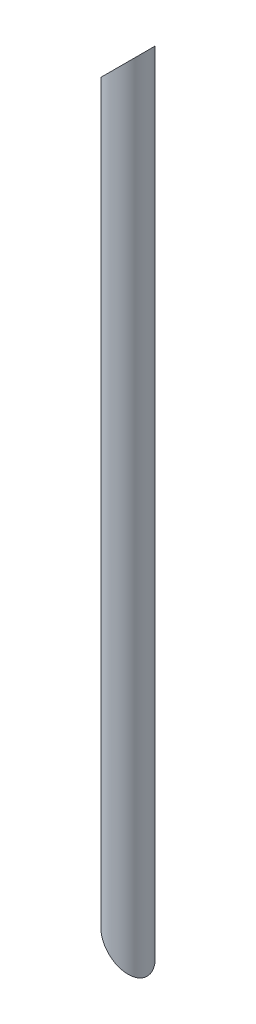
ISO-10303-21;
HEADER;
FILE_DESCRIPTION(('STEP AP214'),'2;1');
FILE_NAME('part.step','',(''),(''),'','','');
FILE_SCHEMA(('AUTOMOTIVE_DESIGN { 1 0 10303 214 1 1 1 1 }'));
ENDSEC;
DATA;
#1=APPLICATION_CONTEXT('core data for automotive mechanical design processes');
#2=APPLICATION_PROTOCOL_DEFINITION('international standard','automotive_design',2000,#1);
#3=PRODUCT_CONTEXT('',#1,'mechanical');
#4=PRODUCT('Part','Part','',(#3));
#5=PRODUCT_RELATED_PRODUCT_CATEGORY('part','',(#4));
#6=PRODUCT_DEFINITION_FORMATION('','',#4);
#7=PRODUCT_DEFINITION_CONTEXT('part definition',#1,'design');
#8=PRODUCT_DEFINITION('design','',#6,#7);
#9=PRODUCT_DEFINITION_SHAPE('','',#8);
#10=(LENGTH_UNIT() NAMED_UNIT(*) SI_UNIT(.MILLI.,.METRE.));
#11=(NAMED_UNIT(*) PLANE_ANGLE_UNIT() SI_UNIT($,.RADIAN.));
#12=(NAMED_UNIT(*) SI_UNIT($,.STERADIAN.) SOLID_ANGLE_UNIT());
#13=UNCERTAINTY_MEASURE_WITH_UNIT(LENGTH_MEASURE(1.E-05),#10,'distance_accuracy_value','');
#14=(GEOMETRIC_REPRESENTATION_CONTEXT(3) GLOBAL_UNCERTAINTY_ASSIGNED_CONTEXT((#13)) GLOBAL_UNIT_ASSIGNED_CONTEXT((#10,
#11,#12)) REPRESENTATION_CONTEXT('',''));
#15=CARTESIAN_POINT('',(0.,0.,0.));
#16=DIRECTION('',(0.,0.,1.));
#17=DIRECTION('',(1.,0.,0.));
#18=AXIS2_PLACEMENT_3D('',#15,#16,#17);
#19=CARTESIAN_POINT('',(0.,0.,0.));
#20=DIRECTION('',(0.,-1.,0.));
#21=DIRECTION('',(1.,0.,0.));
#22=AXIS2_PLACEMENT_3D('',#19,#20,#21);
#23=CYLINDRICAL_SURFACE('',#22,39.3);
#24=CARTESIAN_POINT('',(-4.8762823047736E-13,1600.7,0.));
#25=DIRECTION('',(0.707106781186547,-0.707106781186547,0.));
#26=DIRECTION('',(-0.707106781186548,-0.707106781186548,0.));
#27=AXIS2_PLACEMENT_3D('',#24,#25,#26);
#28=ELLIPSE('',#27,55.5785930012626,39.3);
#29=CARTESIAN_POINT('',(-39.3000000000005,1561.4,0.));
#30=VERTEX_POINT('',#29);
#31=EDGE_CURVE('E45',#30,#30,#28,.F.);
#32=ORIENTED_EDGE('',*,*,#31,.F.);
#33=EDGE_LOOP('',(#32));
#34=FACE_BOUND('',#33,.T.);
#35=CARTESIAN_POINT('',(0.,39.2999999999997,0.));
#36=DIRECTION('',(0.707106781186545,0.70710678118655,0.));
#37=DIRECTION('',(0.70710678118655,-0.707106781186545,0.));
#38=AXIS2_PLACEMENT_3D('',#35,#36,#37);
#39=ELLIPSE('',#38,55.5785930012625,39.3);
#40=CARTESIAN_POINT('',(39.3,0.,0.));
#41=VERTEX_POINT('',#40);
#42=EDGE_CURVE('E10',#41,#41,#39,.F.);
#43=ORIENTED_EDGE('',*,*,#42,.F.);
#44=EDGE_LOOP('',(#43));
#45=FACE_BOUND('',#44,.T.);
#46=ADVANCED_FACE('F37',(#34,#45),#23,.T.);
#47=CARTESIAN_POINT('',(39.3,0.,-39.3));
#48=DIRECTION('',(0.707106781186545,0.70710678118655,0.));
#49=DIRECTION('',(-0.70710678118655,0.707106781186545,0.));
#50=AXIS2_PLACEMENT_3D('',#47,#48,#49);
#51=PLANE('',#50);
#52=CARTESIAN_POINT('',(0.,39.2999999999997,0.));
#53=DIRECTION('',(0.707106781186545,0.70710678118655,0.));
#54=DIRECTION('',(0.70710678118655,-0.707106781186545,0.));
#55=AXIS2_PLACEMENT_3D('',#52,#53,#54);
#56=ELLIPSE('',#55,50.7331882458139,35.8737814398288);
#57=CARTESIAN_POINT('',(35.8737814398288,3.42621856017112,0.));
#58=VERTEX_POINT('',#57);
#59=EDGE_CURVE('E50',#58,#58,#56,.F.);
#60=ORIENTED_EDGE('',*,*,#59,.F.);
#61=EDGE_LOOP('',(#60));
#62=FACE_BOUND('',#61,.T.);
#63=ORIENTED_EDGE('',*,*,#42,.T.);
#64=EDGE_LOOP('',(#63));
#65=FACE_BOUND('',#64,.T.);
#66=ADVANCED_FACE('F66',(#62,#65),#51,.F.);
#67=CARTESIAN_POINT('',(39.2999999999995,1640.,-39.3));
#68=DIRECTION('',(0.707106781186547,-0.707106781186547,0.));
#69=DIRECTION('',(0.707106781186548,0.707106781186548,0.));
#70=AXIS2_PLACEMENT_3D('',#67,#68,#69);
#71=PLANE('',#70);
#72=CARTESIAN_POINT('',(0.,1600.7,0.));
#73=DIRECTION('',(0.707106781186547,-0.707106781186547,0.));
#74=DIRECTION('',(-0.707106781186548,-0.707106781186548,0.));
#75=AXIS2_PLACEMENT_3D('',#72,#73,#74);
#76=ELLIPSE('',#75,50.7331882458141,35.8737814398288);
#77=CARTESIAN_POINT('',(-35.8737814398288,1564.82621856017,0.));
#78=VERTEX_POINT('',#77);
#79=EDGE_CURVE('E40',#78,#78,#76,.F.);
#80=ORIENTED_EDGE('',*,*,#79,.F.);
#81=EDGE_LOOP('',(#80));
#82=FACE_BOUND('',#81,.T.);
#83=ORIENTED_EDGE('',*,*,#31,.T.);
#84=EDGE_LOOP('',(#83));
#85=FACE_BOUND('',#84,.T.);
#86=ADVANCED_FACE('F63',(#82,#85),#71,.F.);
#87=CARTESIAN_POINT('',(0.,1640.,0.));
#88=DIRECTION('',(0.,-1.,0.));
#89=DIRECTION('',(0.,0.,-1.));
#90=AXIS2_PLACEMENT_3D('',#87,#88,#89);
#91=CYLINDRICAL_SURFACE('',#90,35.8737814398288);
#92=ORIENTED_EDGE('',*,*,#79,.T.);
#93=EDGE_LOOP('',(#92));
#94=FACE_BOUND('',#93,.T.);
#95=ORIENTED_EDGE('',*,*,#59,.T.);
#96=EDGE_LOOP('',(#95));
#97=FACE_BOUND('',#96,.T.);
#98=ADVANCED_FACE('F61',(#94,#97),#91,.F.);
#99=CLOSED_SHELL('',(#46,#66,#86,#98));
#100=MANIFOLD_SOLID_BREP('B2',#99);
#101=ADVANCED_BREP_SHAPE_REPRESENTATION('',(#18,#100),#14);
#102=SHAPE_DEFINITION_REPRESENTATION(#9,#101);
ENDSEC;
END-ISO-10303-21;
